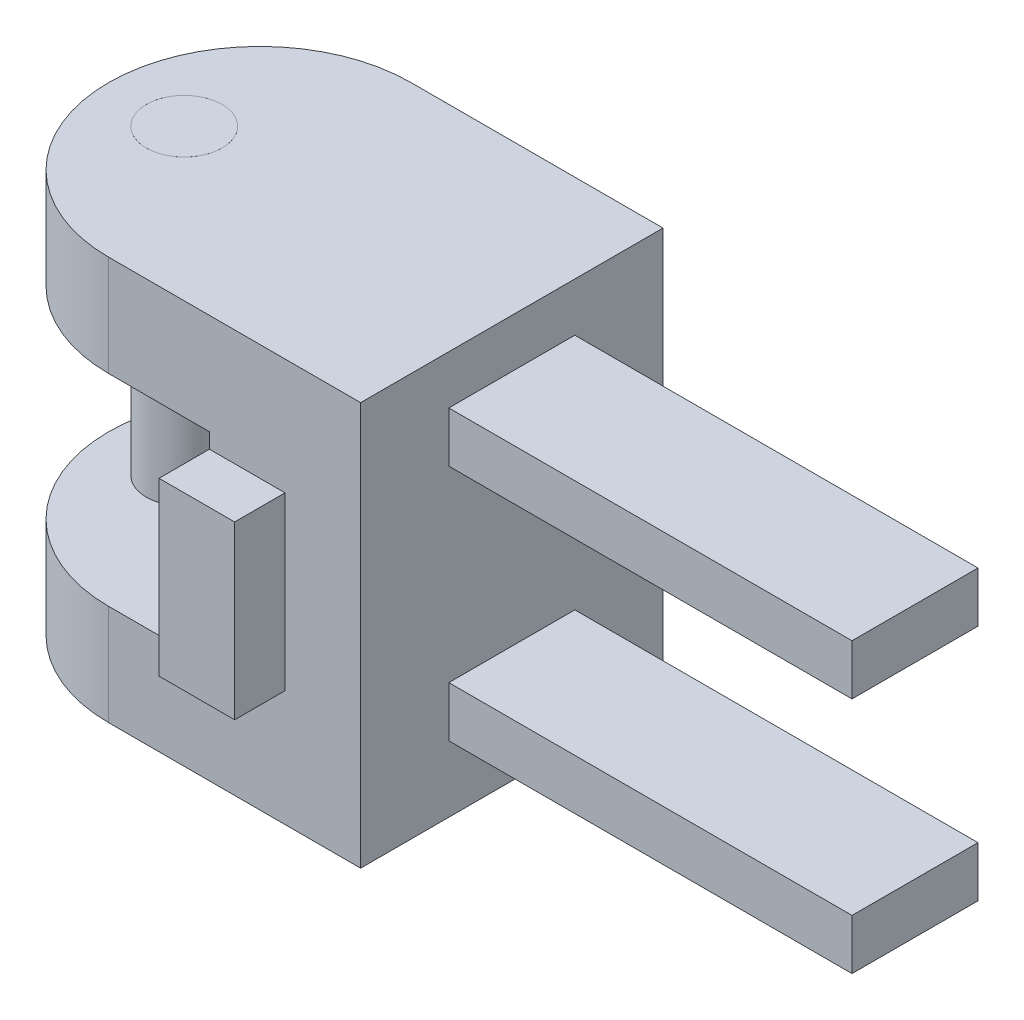
ISO-10303-21;
HEADER;
FILE_DESCRIPTION(('STEP AP214'),'2;1');
FILE_NAME('part.step','',(''),(''),'','','');
FILE_SCHEMA(('AUTOMOTIVE_DESIGN { 1 0 10303 214 1 1 1 1 }'));
ENDSEC;
DATA;
#1=APPLICATION_CONTEXT('core data for automotive mechanical design processes');
#2=APPLICATION_PROTOCOL_DEFINITION('international standard','automotive_design',2000,#1);
#3=PRODUCT_CONTEXT('',#1,'mechanical');
#4=PRODUCT('Part','Part','',(#3));
#5=PRODUCT_RELATED_PRODUCT_CATEGORY('part','',(#4));
#6=PRODUCT_DEFINITION_FORMATION('','',#4);
#7=PRODUCT_DEFINITION_CONTEXT('part definition',#1,'design');
#8=PRODUCT_DEFINITION('design','',#6,#7);
#9=PRODUCT_DEFINITION_SHAPE('','',#8);
#10=(LENGTH_UNIT() NAMED_UNIT(*) SI_UNIT(.MILLI.,.METRE.));
#11=(NAMED_UNIT(*) PLANE_ANGLE_UNIT() SI_UNIT($,.RADIAN.));
#12=(NAMED_UNIT(*) SI_UNIT($,.STERADIAN.) SOLID_ANGLE_UNIT());
#13=UNCERTAINTY_MEASURE_WITH_UNIT(LENGTH_MEASURE(1.E-05),#10,'distance_accuracy_value','');
#14=(GEOMETRIC_REPRESENTATION_CONTEXT(3) GLOBAL_UNCERTAINTY_ASSIGNED_CONTEXT((#13)) GLOBAL_UNIT_ASSIGNED_CONTEXT((#10,
#11,#12)) REPRESENTATION_CONTEXT('',''));
#15=CARTESIAN_POINT('',(0.,0.,0.));
#16=DIRECTION('',(0.,0.,1.));
#17=DIRECTION('',(1.,0.,0.));
#18=AXIS2_PLACEMENT_3D('',#15,#16,#17);
#19=CARTESIAN_POINT('',(-65.,0.,0.));
#20=DIRECTION('',(0.,1.,0.));
#21=DIRECTION('',(0.,0.,1.));
#22=AXIS2_PLACEMENT_3D('',#19,#20,#21);
#23=CYLINDRICAL_SURFACE('',#22,7.50000000000001);
#24=CARTESIAN_POINT('',(-65.,0.,0.));
#25=DIRECTION('',(0.,1.,0.));
#26=DIRECTION('',(0.,0.,1.));
#27=AXIS2_PLACEMENT_3D('',#24,#25,#26);
#28=CIRCLE('',#27,7.50000000000001);
#29=CARTESIAN_POINT('',(-65.,0.,7.50000000000001));
#30=VERTEX_POINT('',#29);
#31=EDGE_CURVE('E11',#30,#30,#28,.T.);
#32=ORIENTED_EDGE('',*,*,#31,.T.);
#33=EDGE_LOOP('',(#32));
#34=FACE_BOUND('',#33,.T.);
#35=CARTESIAN_POINT('',(-65.,80.,0.));
#36=DIRECTION('',(0.,1.,0.));
#37=DIRECTION('',(0.,0.,1.));
#38=AXIS2_PLACEMENT_3D('',#35,#36,#37);
#39=CIRCLE('',#38,7.50000000000001);
#40=CARTESIAN_POINT('',(-65.,80.,7.50000000000001));
#41=VERTEX_POINT('',#40);
#42=EDGE_CURVE('E55',#41,#41,#39,.T.);
#43=ORIENTED_EDGE('',*,*,#42,.F.);
#44=EDGE_LOOP('',(#43));
#45=FACE_BOUND('',#44,.T.);
#46=ADVANCED_FACE('F49',(#34,#45),#23,.T.);
#47=CARTESIAN_POINT('',(-65.,0.,0.));
#48=DIRECTION('',(0.,1.,0.));
#49=DIRECTION('',(0.,0.,1.));
#50=AXIS2_PLACEMENT_3D('',#47,#48,#49);
#51=PLANE('',#50);
#52=ORIENTED_EDGE('',*,*,#31,.F.);
#53=EDGE_LOOP('',(#52));
#54=FACE_BOUND('',#53,.T.);
#55=ADVANCED_FACE('F64',(#54),#51,.F.);
#56=CARTESIAN_POINT('',(-65.,80.,0.));
#57=DIRECTION('',(0.,1.,0.));
#58=DIRECTION('',(0.,0.,1.));
#59=AXIS2_PLACEMENT_3D('',#56,#57,#58);
#60=PLANE('',#59);
#61=ORIENTED_EDGE('',*,*,#42,.T.);
#62=EDGE_LOOP('',(#61));
#63=FACE_BOUND('',#62,.T.);
#64=ADVANCED_FACE('F61',(#63),#60,.T.);
#65=CLOSED_SHELL('',(#46,#55,#64));
#66=MANIFOLD_SOLID_BREP('B2',#65);
#67=CARTESIAN_POINT('',(0.,0.,-30.));
#68=DIRECTION('',(0.,0.,-1.));
#69=DIRECTION('',(-1.,0.,0.));
#70=AXIS2_PLACEMENT_3D('',#67,#68,#69);
#71=PLANE('',#70);
#72=DIRECTION('',(0.,-1.,0.));
#73=VECTOR('',#72,1.);
#74=CARTESIAN_POINT('',(-15.,57.,-30.));
#75=LINE('',#74,#73);
#76=CARTESIAN_POINT('',(-15.,57.,-30.));
#77=VERTEX_POINT('',#76);
#78=CARTESIAN_POINT('',(-15.,23.,-30.));
#79=VERTEX_POINT('',#78);
#80=EDGE_CURVE('E944',#77,#79,#75,.T.);
#81=ORIENTED_EDGE('',*,*,#80,.F.);
#82=DIRECTION('',(1.,0.,0.));
#83=VECTOR('',#82,1.);
#84=CARTESIAN_POINT('',(-30.,57.,-30.));
#85=LINE('',#84,#83);
#86=CARTESIAN_POINT('',(-30.,57.,-30.));
#87=VERTEX_POINT('',#86);
#88=EDGE_CURVE('E958',#87,#77,#85,.T.);
#89=ORIENTED_EDGE('',*,*,#88,.F.);
#90=DIRECTION('',(0.,1.,0.));
#91=VECTOR('',#90,1.);
#92=CARTESIAN_POINT('',(-30.,20.,-30.));
#93=LINE('',#92,#91);
#94=CARTESIAN_POINT('',(-30.,60.,-30.));
#95=VERTEX_POINT('',#94);
#96=EDGE_CURVE('E289',#87,#95,#93,.T.);
#97=ORIENTED_EDGE('',*,*,#96,.T.);
#98=DIRECTION('',(1.,0.,0.));
#99=VECTOR('',#98,1.);
#100=CARTESIAN_POINT('',(-80.,60.,-30.));
#101=LINE('',#100,#99);
#102=CARTESIAN_POINT('',(-50.,60.,-30.));
#103=VERTEX_POINT('',#102);
#104=EDGE_CURVE('E437',#103,#95,#101,.T.);
#105=ORIENTED_EDGE('',*,*,#104,.F.);
#106=DIRECTION('',(0.,-1.,0.));
#107=VECTOR('',#106,1.);
#108=CARTESIAN_POINT('',(-50.,0.,-30.));
#109=LINE('',#108,#107);
#110=CARTESIAN_POINT('',(-50.,80.,-30.));
#111=VERTEX_POINT('',#110);
#112=EDGE_CURVE('E98',#103,#111,#109,.F.);
#113=ORIENTED_EDGE('',*,*,#112,.T.);
#114=DIRECTION('',(-1.,0.,0.));
#115=VECTOR('',#114,1.);
#116=CARTESIAN_POINT('',(0.,80.,-30.));
#117=LINE('',#116,#115);
#118=CARTESIAN_POINT('',(0.,80.,-30.));
#119=VERTEX_POINT('',#118);
#120=EDGE_CURVE('E441',#119,#111,#117,.T.);
#121=ORIENTED_EDGE('',*,*,#120,.F.);
#122=DIRECTION('',(0.,-1.,0.));
#123=VECTOR('',#122,1.);
#124=CARTESIAN_POINT('',(0.,40.,-30.));
#125=LINE('',#124,#123);
#126=CARTESIAN_POINT('',(0.,0.,-30.));
#127=VERTEX_POINT('',#126);
#128=EDGE_CURVE('E477',#119,#127,#125,.T.);
#129=ORIENTED_EDGE('',*,*,#128,.T.);
#130=DIRECTION('',(-1.,0.,0.));
#131=VECTOR('',#130,1.);
#132=CARTESIAN_POINT('',(0.,0.,-30.));
#133=LINE('',#132,#131);
#134=CARTESIAN_POINT('',(-50.,0.,-30.));
#135=VERTEX_POINT('',#134);
#136=EDGE_CURVE('E481',#127,#135,#133,.T.);
#137=ORIENTED_EDGE('',*,*,#136,.T.);
#138=DIRECTION('',(0.,1.,0.));
#139=VECTOR('',#138,1.);
#140=CARTESIAN_POINT('',(-50.,20.,-30.));
#141=LINE('',#140,#139);
#142=CARTESIAN_POINT('',(-50.,20.,-30.));
#143=VERTEX_POINT('',#142);
#144=EDGE_CURVE('E511',#135,#143,#141,.T.);
#145=ORIENTED_EDGE('',*,*,#144,.T.);
#146=DIRECTION('',(1.,0.,0.));
#147=VECTOR('',#146,1.);
#148=CARTESIAN_POINT('',(-80.,20.,-30.));
#149=LINE('',#148,#147);
#150=CARTESIAN_POINT('',(-30.,20.,-30.));
#151=VERTEX_POINT('',#150);
#152=EDGE_CURVE('E485',#143,#151,#149,.T.);
#153=ORIENTED_EDGE('',*,*,#152,.T.);
#154=CARTESIAN_POINT('',(-30.,23.,-30.));
#155=VERTEX_POINT('',#154);
#156=EDGE_CURVE('E488',#151,#155,#93,.T.);
#157=ORIENTED_EDGE('',*,*,#156,.T.);
#158=DIRECTION('',(-1.,0.,0.));
#159=VECTOR('',#158,1.);
#160=CARTESIAN_POINT('',(-30.,23.,-30.));
#161=LINE('',#160,#159);
#162=EDGE_CURVE('E283',#79,#155,#161,.T.);
#163=ORIENTED_EDGE('',*,*,#162,.F.);
#164=EDGE_LOOP('',(#81,#89,#97,#105,#113,#121,#129,#137,#145,#153,#157,#163));
#165=FACE_BOUND('',#164,.T.);
#166=ADVANCED_FACE('F89',(#165),#71,.T.);
#167=CARTESIAN_POINT('',(0.,40.,-30.));
#168=DIRECTION('',(-1.,0.,0.));
#169=DIRECTION('',(0.,-1.,0.));
#170=AXIS2_PLACEMENT_3D('',#167,#168,#169);
#171=PLANE('',#170);
#172=DIRECTION('',(0.,1.,0.));
#173=VECTOR('',#172,1.);
#174=CARTESIAN_POINT('',(0.,60.3368659406556,-12.5));
#175=LINE('',#174,#173);
#176=CARTESIAN_POINT('',(0.,60.3368659406556,-12.5));
#177=VERTEX_POINT('',#176);
#178=CARTESIAN_POINT('',(0.,70.3368659406556,-12.5));
#179=VERTEX_POINT('',#178);
#180=EDGE_CURVE('E379',#177,#179,#175,.T.);
#181=ORIENTED_EDGE('',*,*,#180,.F.);
#182=DIRECTION('',(0.,0.,-1.));
#183=VECTOR('',#182,1.);
#184=CARTESIAN_POINT('',(0.,60.3368659406556,-12.5));
#185=LINE('',#184,#183);
#186=CARTESIAN_POINT('',(0.,60.3368659406556,12.5));
#187=VERTEX_POINT('',#186);
#188=EDGE_CURVE('E385',#187,#177,#185,.T.);
#189=ORIENTED_EDGE('',*,*,#188,.F.);
#190=DIRECTION('',(0.,-1.,0.));
#191=VECTOR('',#190,1.);
#192=CARTESIAN_POINT('',(0.,60.3368659406556,12.5));
#193=LINE('',#192,#191);
#194=CARTESIAN_POINT('',(0.,70.3368659406556,12.5));
#195=VERTEX_POINT('',#194);
#196=EDGE_CURVE('E402',#195,#187,#193,.T.);
#197=ORIENTED_EDGE('',*,*,#196,.F.);
#198=DIRECTION('',(0.,0.,1.));
#199=VECTOR('',#198,1.);
#200=CARTESIAN_POINT('',(0.,70.3368659406556,-12.5));
#201=LINE('',#200,#199);
#202=EDGE_CURVE('E398',#179,#195,#201,.T.);
#203=ORIENTED_EDGE('',*,*,#202,.F.);
#204=EDGE_LOOP('',(#181,#189,#197,#203));
#205=FACE_BOUND('',#204,.T.);
#206=ORIENTED_EDGE('',*,*,#128,.F.);
#207=DIRECTION('',(0.,0.,1.));
#208=VECTOR('',#207,1.);
#209=CARTESIAN_POINT('',(0.,80.,-30.));
#210=LINE('',#209,#208);
#211=CARTESIAN_POINT('',(0.,80.,30.));
#212=VERTEX_POINT('',#211);
#213=EDGE_CURVE('E445',#119,#212,#210,.T.);
#214=ORIENTED_EDGE('',*,*,#213,.T.);
#215=DIRECTION('',(0.,-1.,0.));
#216=VECTOR('',#215,1.);
#217=CARTESIAN_POINT('',(0.,40.,30.));
#218=LINE('',#217,#216);
#219=CARTESIAN_POINT('',(0.,0.,30.));
#220=VERTEX_POINT('',#219);
#221=EDGE_CURVE('E461',#212,#220,#218,.T.);
#222=ORIENTED_EDGE('',*,*,#221,.T.);
#223=DIRECTION('',(0.,0.,1.));
#224=VECTOR('',#223,1.);
#225=CARTESIAN_POINT('',(0.,0.,-30.));
#226=LINE('',#225,#224);
#227=EDGE_CURVE('E495',#127,#220,#226,.T.);
#228=ORIENTED_EDGE('',*,*,#227,.F.);
#229=EDGE_LOOP('',(#206,#214,#222,#228));
#230=FACE_BOUND('',#229,.T.);
#231=DIRECTION('',(0.,1.,0.));
#232=VECTOR('',#231,1.);
#233=CARTESIAN_POINT('',(0.,13.1389492179323,-12.5));
#234=LINE('',#233,#232);
#235=CARTESIAN_POINT('',(0.,13.1389492179323,-12.5));
#236=VERTEX_POINT('',#235);
#237=CARTESIAN_POINT('',(0.,23.1389492179323,-12.5));
#238=VERTEX_POINT('',#237);
#239=EDGE_CURVE('E323',#236,#238,#234,.T.);
#240=ORIENTED_EDGE('',*,*,#239,.F.);
#241=DIRECTION('',(0.,0.,-1.));
#242=VECTOR('',#241,1.);
#243=CARTESIAN_POINT('',(0.,13.1389492179323,-12.5));
#244=LINE('',#243,#242);
#245=CARTESIAN_POINT('',(0.,13.1389492179323,12.5));
#246=VERTEX_POINT('',#245);
#247=EDGE_CURVE('E340',#246,#236,#244,.T.);
#248=ORIENTED_EDGE('',*,*,#247,.F.);
#249=DIRECTION('',(0.,-1.,0.));
#250=VECTOR('',#249,1.);
#251=CARTESIAN_POINT('',(0.,13.1389492179323,12.5));
#252=LINE('',#251,#250);
#253=CARTESIAN_POINT('',(0.,23.1389492179324,12.5));
#254=VERTEX_POINT('',#253);
#255=EDGE_CURVE('E357',#254,#246,#252,.T.);
#256=ORIENTED_EDGE('',*,*,#255,.F.);
#257=DIRECTION('',(0.,0.,1.));
#258=VECTOR('',#257,1.);
#259=CARTESIAN_POINT('',(0.,23.1389492179323,-12.5));
#260=LINE('',#259,#258);
#261=EDGE_CURVE('E353',#238,#254,#260,.T.);
#262=ORIENTED_EDGE('',*,*,#261,.F.);
#263=EDGE_LOOP('',(#240,#248,#256,#262));
#264=FACE_BOUND('',#263,.T.);
#265=ADVANCED_FACE('F563',(#205,#230,#264),#171,.F.);
#266=CARTESIAN_POINT('',(0.,0.,-30.));
#267=DIRECTION('',(0.,1.,0.));
#268=DIRECTION('',(-1.,0.,0.));
#269=AXIS2_PLACEMENT_3D('',#266,#267,#268);
#270=PLANE('',#269);
#271=CARTESIAN_POINT('',(-65.,0.,0.));
#272=DIRECTION('',(0.,1.,0.));
#273=DIRECTION('',(-1.,0.,0.));
#274=AXIS2_PLACEMENT_3D('',#271,#272,#273);
#275=CIRCLE('',#274,7.50000000000001);
#276=CARTESIAN_POINT('',(-72.5,0.,0.));
#277=VERTEX_POINT('',#276);
#278=EDGE_CURVE('E457',#277,#277,#275,.T.);
#279=ORIENTED_EDGE('',*,*,#278,.T.);
#280=EDGE_LOOP('',(#279));
#281=FACE_BOUND('',#280,.T.);
#282=CARTESIAN_POINT('',(-50.,0.,0.));
#283=DIRECTION('',(0.,1.,0.));
#284=DIRECTION('',(-1.,0.,0.));
#285=AXIS2_PLACEMENT_3D('',#282,#283,#284);
#286=CIRCLE('',#285,30.);
#287=CARTESIAN_POINT('',(-50.,0.,30.));
#288=VERTEX_POINT('',#287);
#289=CARTESIAN_POINT('',(-80.,0.,0.));
#290=VERTEX_POINT('',#289);
#291=EDGE_CURVE('E508',#288,#290,#286,.F.);
#292=ORIENTED_EDGE('',*,*,#291,.T.);
#293=CARTESIAN_POINT('',(-50.,0.,0.));
#294=DIRECTION('',(0.,1.,0.));
#295=DIRECTION('',(-1.,0.,0.));
#296=AXIS2_PLACEMENT_3D('',#293,#294,#295);
#297=CIRCLE('',#296,30.);
#298=EDGE_CURVE('E518',#290,#135,#297,.F.);
#299=ORIENTED_EDGE('',*,*,#298,.T.);
#300=ORIENTED_EDGE('',*,*,#136,.F.);
#301=ORIENTED_EDGE('',*,*,#227,.T.);
#302=DIRECTION('',(-1.,0.,0.));
#303=VECTOR('',#302,1.);
#304=CARTESIAN_POINT('',(0.,0.,30.));
#305=LINE('',#304,#303);
#306=EDGE_CURVE('E465',#220,#288,#305,.T.);
#307=ORIENTED_EDGE('',*,*,#306,.T.);
#308=EDGE_LOOP('',(#292,#299,#300,#301,#307));
#309=FACE_BOUND('',#308,.T.);
#310=ADVANCED_FACE('F582',(#281,#309),#270,.F.);
#311=CARTESIAN_POINT('',(-80.,20.,-30.));
#312=DIRECTION('',(0.,-1.,0.));
#313=DIRECTION('',(0.,0.,-1.));
#314=AXIS2_PLACEMENT_3D('',#311,#312,#313);
#315=PLANE('',#314);
#316=CARTESIAN_POINT('',(-65.,20.,0.));
#317=DIRECTION('',(0.,1.,0.));
#318=DIRECTION('',(0.,0.,1.));
#319=AXIS2_PLACEMENT_3D('',#316,#317,#318);
#320=CIRCLE('',#319,7.50000000000001);
#321=CARTESIAN_POINT('',(-65.,20.,7.50000000000001));
#322=VERTEX_POINT('',#321);
#323=EDGE_CURVE('E453',#322,#322,#320,.T.);
#324=ORIENTED_EDGE('',*,*,#323,.F.);
#325=EDGE_LOOP('',(#324));
#326=FACE_BOUND('',#325,.T.);
#327=ORIENTED_EDGE('',*,*,#152,.F.);
#328=CARTESIAN_POINT('',(-50.,20.,0.));
#329=DIRECTION('',(0.,-1.,0.));
#330=DIRECTION('',(0.,0.,-1.));
#331=AXIS2_PLACEMENT_3D('',#328,#329,#330);
#332=CIRCLE('',#331,30.);
#333=CARTESIAN_POINT('',(-80.,20.,0.));
#334=VERTEX_POINT('',#333);
#335=EDGE_CURVE('E515',#143,#334,#332,.F.);
#336=ORIENTED_EDGE('',*,*,#335,.T.);
#337=CARTESIAN_POINT('',(-50.,20.,0.));
#338=DIRECTION('',(0.,-1.,0.));
#339=DIRECTION('',(0.,0.,-1.));
#340=AXIS2_PLACEMENT_3D('',#337,#338,#339);
#341=CIRCLE('',#340,30.);
#342=CARTESIAN_POINT('',(-50.,20.,30.));
#343=VERTEX_POINT('',#342);
#344=EDGE_CURVE('E502',#334,#343,#341,.F.);
#345=ORIENTED_EDGE('',*,*,#344,.T.);
#346=DIRECTION('',(1.,0.,0.));
#347=VECTOR('',#346,1.);
#348=CARTESIAN_POINT('',(-80.,20.,30.));
#349=LINE('',#348,#347);
#350=CARTESIAN_POINT('',(-30.,20.,30.));
#351=VERTEX_POINT('',#350);
#352=EDGE_CURVE('E469',#343,#351,#349,.T.);
#353=ORIENTED_EDGE('',*,*,#352,.T.);
#354=DIRECTION('',(0.,0.,1.));
#355=VECTOR('',#354,1.);
#356=CARTESIAN_POINT('',(-30.,20.,-30.));
#357=LINE('',#356,#355);
#358=EDGE_CURVE('E492',#151,#351,#357,.T.);
#359=ORIENTED_EDGE('',*,*,#358,.F.);
#360=EDGE_LOOP('',(#327,#336,#345,#353,#359));
#361=FACE_BOUND('',#360,.T.);
#362=ADVANCED_FACE('F574',(#326,#361),#315,.F.);
#363=CARTESIAN_POINT('',(-30.,20.,-30.));
#364=DIRECTION('',(1.,0.,0.));
#365=DIRECTION('',(0.,0.,-1.));
#366=AXIS2_PLACEMENT_3D('',#363,#364,#365);
#367=PLANE('',#366);
#368=ORIENTED_EDGE('',*,*,#358,.T.);
#369=DIRECTION('',(0.,1.,0.));
#370=VECTOR('',#369,1.);
#371=CARTESIAN_POINT('',(-30.,20.,30.));
#372=LINE('',#371,#370);
#373=CARTESIAN_POINT('',(-30.,23.,30.));
#374=VERTEX_POINT('',#373);
#375=EDGE_CURVE('E473',#351,#374,#372,.T.);
#376=ORIENTED_EDGE('',*,*,#375,.T.);
#377=DIRECTION('',(0.,0.,-1.));
#378=VECTOR('',#377,1.);
#379=CARTESIAN_POINT('',(-30.,23.,40.));
#380=LINE('',#379,#378);
#381=CARTESIAN_POINT('',(-30.,23.,40.));
#382=VERTEX_POINT('',#381);
#383=EDGE_CURVE('E324',#382,#374,#380,.T.);
#384=ORIENTED_EDGE('',*,*,#383,.F.);
#385=DIRECTION('',(0.,1.,0.));
#386=VECTOR('',#385,1.);
#387=CARTESIAN_POINT('',(-30.,23.,40.));
#388=LINE('',#387,#386);
#389=CARTESIAN_POINT('',(-30.,57.,40.));
#390=VERTEX_POINT('',#389);
#391=EDGE_CURVE('E310',#382,#390,#388,.T.);
#392=ORIENTED_EDGE('',*,*,#391,.T.);
#393=DIRECTION('',(0.,0.,-1.));
#394=VECTOR('',#393,1.);
#395=CARTESIAN_POINT('',(-30.,57.,40.));
#396=LINE('',#395,#394);
#397=CARTESIAN_POINT('',(-30.,57.,30.));
#398=VERTEX_POINT('',#397);
#399=EDGE_CURVE('E319',#390,#398,#396,.T.);
#400=ORIENTED_EDGE('',*,*,#399,.T.);
#401=CARTESIAN_POINT('',(-30.,60.,30.));
#402=VERTEX_POINT('',#401);
#403=EDGE_CURVE('E472',#398,#402,#372,.T.);
#404=ORIENTED_EDGE('',*,*,#403,.T.);
#405=DIRECTION('',(0.,0.,1.));
#406=VECTOR('',#405,1.);
#407=CARTESIAN_POINT('',(-30.,60.,-30.));
#408=LINE('',#407,#406);
#409=EDGE_CURVE('E449',#95,#402,#408,.T.);
#410=ORIENTED_EDGE('',*,*,#409,.F.);
#411=ORIENTED_EDGE('',*,*,#96,.F.);
#412=DIRECTION('',(0.,0.,1.));
#413=VECTOR('',#412,1.);
#414=CARTESIAN_POINT('',(-30.,57.,-40.));
#415=LINE('',#414,#413);
#416=CARTESIAN_POINT('',(-30.,57.,-40.));
#417=VERTEX_POINT('',#416);
#418=EDGE_CURVE('E266',#417,#87,#415,.T.);
#419=ORIENTED_EDGE('',*,*,#418,.F.);
#420=DIRECTION('',(0.,1.,0.));
#421=VECTOR('',#420,1.);
#422=CARTESIAN_POINT('',(-30.,57.,-40.));
#423=LINE('',#422,#421);
#424=CARTESIAN_POINT('',(-30.,23.,-40.));
#425=VERTEX_POINT('',#424);
#426=EDGE_CURVE('E274',#425,#417,#423,.T.);
#427=ORIENTED_EDGE('',*,*,#426,.F.);
#428=DIRECTION('',(0.,0.,1.));
#429=VECTOR('',#428,1.);
#430=CARTESIAN_POINT('',(-30.,23.,-40.));
#431=LINE('',#430,#429);
#432=EDGE_CURVE('E942',#425,#155,#431,.T.);
#433=ORIENTED_EDGE('',*,*,#432,.T.);
#434=ORIENTED_EDGE('',*,*,#156,.F.);
#435=EDGE_LOOP('',(#368,#376,#384,#392,#400,#404,#410,#411,#419,#427,#433,#434));
#436=FACE_BOUND('',#435,.T.);
#437=ADVANCED_FACE('F287',(#436),#367,.F.);
#438=CARTESIAN_POINT('',(0.,0.,30.));
#439=DIRECTION('',(0.,0.,-1.));
#440=DIRECTION('',(-1.,0.,0.));
#441=AXIS2_PLACEMENT_3D('',#438,#439,#440);
#442=PLANE('',#441);
#443=ORIENTED_EDGE('',*,*,#403,.F.);
#444=DIRECTION('',(1.,0.,0.));
#445=VECTOR('',#444,1.);
#446=CARTESIAN_POINT('',(-30.,57.,30.));
#447=LINE('',#446,#445);
#448=CARTESIAN_POINT('',(-15.,57.,30.));
#449=VERTEX_POINT('',#448);
#450=EDGE_CURVE('E291',#398,#449,#447,.T.);
#451=ORIENTED_EDGE('',*,*,#450,.T.);
#452=DIRECTION('',(0.,1.,0.));
#453=VECTOR('',#452,1.);
#454=CARTESIAN_POINT('',(-15.,23.,30.));
#455=LINE('',#454,#453);
#456=CARTESIAN_POINT('',(-15.,23.,30.));
#457=VERTEX_POINT('',#456);
#458=EDGE_CURVE('E113',#457,#449,#455,.T.);
#459=ORIENTED_EDGE('',*,*,#458,.F.);
#460=DIRECTION('',(1.,0.,0.));
#461=VECTOR('',#460,1.);
#462=CARTESIAN_POINT('',(-30.,23.,30.));
#463=LINE('',#462,#461);
#464=EDGE_CURVE('E304',#374,#457,#463,.T.);
#465=ORIENTED_EDGE('',*,*,#464,.F.);
#466=ORIENTED_EDGE('',*,*,#375,.F.);
#467=ORIENTED_EDGE('',*,*,#352,.F.);
#468=DIRECTION('',(0.,1.,0.));
#469=VECTOR('',#468,1.);
#470=CARTESIAN_POINT('',(-50.,0.,30.));
#471=LINE('',#470,#469);
#472=EDGE_CURVE('E505',#343,#288,#471,.F.);
#473=ORIENTED_EDGE('',*,*,#472,.T.);
#474=ORIENTED_EDGE('',*,*,#306,.F.);
#475=ORIENTED_EDGE('',*,*,#221,.F.);
#476=DIRECTION('',(-1.,0.,0.));
#477=VECTOR('',#476,1.);
#478=CARTESIAN_POINT('',(0.,80.,30.));
#479=LINE('',#478,#477);
#480=CARTESIAN_POINT('',(-50.,80.,30.));
#481=VERTEX_POINT('',#480);
#482=EDGE_CURVE('E433',#212,#481,#479,.T.);
#483=ORIENTED_EDGE('',*,*,#482,.T.);
#484=DIRECTION('',(0.,-1.,0.));
#485=VECTOR('',#484,1.);
#486=CARTESIAN_POINT('',(-50.,60.,30.));
#487=LINE('',#486,#485);
#488=CARTESIAN_POINT('',(-50.,60.,30.));
#489=VERTEX_POINT('',#488);
#490=EDGE_CURVE('E521',#481,#489,#487,.T.);
#491=ORIENTED_EDGE('',*,*,#490,.T.);
#492=DIRECTION('',(1.,0.,0.));
#493=VECTOR('',#492,1.);
#494=CARTESIAN_POINT('',(-80.,60.,30.));
#495=LINE('',#494,#493);
#496=EDGE_CURVE('E429',#489,#402,#495,.T.);
#497=ORIENTED_EDGE('',*,*,#496,.T.);
#498=EDGE_LOOP('',(#443,#451,#459,#465,#466,#467,#473,#474,#475,#483,#491,#497));
#499=FACE_BOUND('',#498,.T.);
#500=ADVANCED_FACE('F558',(#499),#442,.F.);
#501=CARTESIAN_POINT('',(-65.,-10.,0.));
#502=DIRECTION('',(0.,1.,0.));
#503=DIRECTION('',(0.,0.,1.));
#504=AXIS2_PLACEMENT_3D('',#501,#502,#503);
#505=CYLINDRICAL_SURFACE('',#504,7.50000000000001);
#506=ORIENTED_EDGE('',*,*,#323,.T.);
#507=EDGE_LOOP('',(#506));
#508=FACE_BOUND('',#507,.T.);
#509=ORIENTED_EDGE('',*,*,#278,.F.);
#510=EDGE_LOOP('',(#509));
#511=FACE_BOUND('',#510,.T.);
#512=ADVANCED_FACE('F605',(#508,#511),#505,.F.);
#513=CARTESIAN_POINT('',(-50.,0.,0.));
#514=DIRECTION('',(0.,1.,0.));
#515=DIRECTION('',(0.,0.,1.));
#516=AXIS2_PLACEMENT_3D('',#513,#514,#515);
#517=CYLINDRICAL_SURFACE('',#516,30.);
#518=ORIENTED_EDGE('',*,*,#291,.F.);
#519=ORIENTED_EDGE('',*,*,#472,.F.);
#520=ORIENTED_EDGE('',*,*,#344,.F.);
#521=DIRECTION('',(0.,1.,0.));
#522=VECTOR('',#521,1.);
#523=CARTESIAN_POINT('',(-80.,0.,0.));
#524=LINE('',#523,#522);
#525=EDGE_CURVE('E498',#290,#334,#524,.T.);
#526=ORIENTED_EDGE('',*,*,#525,.F.);
#527=EDGE_LOOP('',(#518,#519,#520,#526));
#528=FACE_BOUND('',#527,.T.);
#529=ADVANCED_FACE('F580',(#528),#517,.T.);
#530=CARTESIAN_POINT('',(-50.,0.,0.));
#531=DIRECTION('',(0.,-1.,0.));
#532=DIRECTION('',(0.,0.,-1.));
#533=AXIS2_PLACEMENT_3D('',#530,#531,#532);
#534=CYLINDRICAL_SURFACE('',#533,30.);
#535=ORIENTED_EDGE('',*,*,#298,.F.);
#536=ORIENTED_EDGE('',*,*,#525,.T.);
#537=ORIENTED_EDGE('',*,*,#335,.F.);
#538=ORIENTED_EDGE('',*,*,#144,.F.);
#539=EDGE_LOOP('',(#535,#536,#537,#538));
#540=FACE_BOUND('',#539,.T.);
#541=ADVANCED_FACE('F570',(#540),#534,.T.);
#542=CARTESIAN_POINT('',(-80.,60.,-30.));
#543=DIRECTION('',(0.,-1.,0.));
#544=DIRECTION('',(0.,0.,-1.));
#545=AXIS2_PLACEMENT_3D('',#542,#543,#544);
#546=PLANE('',#545);
#547=CARTESIAN_POINT('',(-65.,60.,0.));
#548=DIRECTION('',(0.,1.,0.));
#549=DIRECTION('',(0.,0.,1.));
#550=AXIS2_PLACEMENT_3D('',#547,#548,#549);
#551=CIRCLE('',#550,7.50000000000001);
#552=CARTESIAN_POINT('',(-65.,60.,7.50000000000001));
#553=VERTEX_POINT('',#552);
#554=EDGE_CURVE('E424',#553,#553,#551,.T.);
#555=ORIENTED_EDGE('',*,*,#554,.T.);
#556=EDGE_LOOP('',(#555));
#557=FACE_BOUND('',#556,.T.);
#558=CARTESIAN_POINT('',(-50.,60.,0.));
#559=DIRECTION('',(0.,-1.,0.));
#560=DIRECTION('',(0.,0.,-1.));
#561=AXIS2_PLACEMENT_3D('',#558,#559,#560);
#562=CIRCLE('',#561,30.);
#563=CARTESIAN_POINT('',(-80.,60.,0.));
#564=VERTEX_POINT('',#563);
#565=EDGE_CURVE('E528',#489,#564,#562,.T.);
#566=ORIENTED_EDGE('',*,*,#565,.T.);
#567=CARTESIAN_POINT('',(-50.,60.,0.));
#568=DIRECTION('',(0.,-1.,0.));
#569=DIRECTION('',(0.,0.,-1.));
#570=AXIS2_PLACEMENT_3D('',#567,#568,#569);
#571=CIRCLE('',#570,30.);
#572=EDGE_CURVE('E539',#564,#103,#571,.T.);
#573=ORIENTED_EDGE('',*,*,#572,.T.);
#574=ORIENTED_EDGE('',*,*,#104,.T.);
#575=ORIENTED_EDGE('',*,*,#409,.T.);
#576=ORIENTED_EDGE('',*,*,#496,.F.);
#577=EDGE_LOOP('',(#566,#573,#574,#575,#576));
#578=FACE_BOUND('',#577,.T.);
#579=ADVANCED_FACE('F616',(#557,#578),#546,.T.);
#580=CARTESIAN_POINT('',(0.,80.,-30.));
#581=DIRECTION('',(0.,1.,0.));
#582=DIRECTION('',(-1.,0.,0.));
#583=AXIS2_PLACEMENT_3D('',#580,#581,#582);
#584=PLANE('',#583);
#585=CARTESIAN_POINT('',(-65.,80.,0.));
#586=DIRECTION('',(0.,1.,0.));
#587=DIRECTION('',(-1.,0.,0.));
#588=AXIS2_PLACEMENT_3D('',#585,#586,#587);
#589=CIRCLE('',#588,7.50000000000001);
#590=CARTESIAN_POINT('',(-72.5,80.,0.));
#591=VERTEX_POINT('',#590);
#592=EDGE_CURVE('E428',#591,#591,#589,.F.);
#593=ORIENTED_EDGE('',*,*,#592,.T.);
#594=EDGE_LOOP('',(#593));
#595=FACE_BOUND('',#594,.T.);
#596=ORIENTED_EDGE('',*,*,#120,.T.);
#597=CARTESIAN_POINT('',(-50.,80.,0.));
#598=DIRECTION('',(0.,1.,0.));
#599=DIRECTION('',(-1.,0.,0.));
#600=AXIS2_PLACEMENT_3D('',#597,#598,#599);
#601=CIRCLE('',#600,30.);
#602=CARTESIAN_POINT('',(-80.,80.,0.));
#603=VERTEX_POINT('',#602);
#604=EDGE_CURVE('E47',#111,#603,#601,.T.);
#605=ORIENTED_EDGE('',*,*,#604,.T.);
#606=CARTESIAN_POINT('',(-50.,80.,0.));
#607=DIRECTION('',(0.,1.,0.));
#608=DIRECTION('',(-1.,0.,0.));
#609=AXIS2_PLACEMENT_3D('',#606,#607,#608);
#610=CIRCLE('',#609,30.);
#611=EDGE_CURVE('E536',#603,#481,#610,.T.);
#612=ORIENTED_EDGE('',*,*,#611,.T.);
#613=ORIENTED_EDGE('',*,*,#482,.F.);
#614=ORIENTED_EDGE('',*,*,#213,.F.);
#615=EDGE_LOOP('',(#596,#605,#612,#613,#614));
#616=FACE_BOUND('',#615,.T.);
#617=ADVANCED_FACE('F551',(#595,#616),#584,.T.);
#618=CARTESIAN_POINT('',(-65.,90.,0.));
#619=DIRECTION('',(0.,-1.,0.));
#620=DIRECTION('',(0.,0.,-1.));
#621=AXIS2_PLACEMENT_3D('',#618,#619,#620);
#622=CYLINDRICAL_SURFACE('',#621,7.50000000000001);
#623=ORIENTED_EDGE('',*,*,#592,.F.);
#624=EDGE_LOOP('',(#623));
#625=FACE_BOUND('',#624,.T.);
#626=ORIENTED_EDGE('',*,*,#554,.F.);
#627=EDGE_LOOP('',(#626));
#628=FACE_BOUND('',#627,.T.);
#629=ADVANCED_FACE('F622',(#625,#628),#622,.F.);
#630=CARTESIAN_POINT('',(-50.,0.,0.));
#631=DIRECTION('',(0.,1.,0.));
#632=DIRECTION('',(0.,0.,1.));
#633=AXIS2_PLACEMENT_3D('',#630,#631,#632);
#634=CYLINDRICAL_SURFACE('',#633,30.);
#635=ORIENTED_EDGE('',*,*,#611,.F.);
#636=DIRECTION('',(0.,-1.,0.));
#637=VECTOR('',#636,1.);
#638=CARTESIAN_POINT('',(-80.,80.,0.));
#639=LINE('',#638,#637);
#640=EDGE_CURVE('E532',#564,#603,#639,.F.);
#641=ORIENTED_EDGE('',*,*,#640,.F.);
#642=ORIENTED_EDGE('',*,*,#565,.F.);
#643=ORIENTED_EDGE('',*,*,#490,.F.);
#644=EDGE_LOOP('',(#635,#641,#642,#643));
#645=FACE_BOUND('',#644,.T.);
#646=ADVANCED_FACE('F556',(#645),#634,.T.);
#647=CARTESIAN_POINT('',(-50.,80.,0.));
#648=DIRECTION('',(0.,-1.,0.));
#649=DIRECTION('',(0.,0.,-1.));
#650=AXIS2_PLACEMENT_3D('',#647,#648,#649);
#651=CYLINDRICAL_SURFACE('',#650,30.);
#652=ORIENTED_EDGE('',*,*,#604,.F.);
#653=ORIENTED_EDGE('',*,*,#112,.F.);
#654=ORIENTED_EDGE('',*,*,#572,.F.);
#655=ORIENTED_EDGE('',*,*,#640,.T.);
#656=EDGE_LOOP('',(#652,#653,#654,#655));
#657=FACE_BOUND('',#656,.T.);
#658=ADVANCED_FACE('F91',(#657),#651,.T.);
#659=CARTESIAN_POINT('',(80.,60.3368659406556,-12.5));
#660=DIRECTION('',(0.,0.,1.));
#661=DIRECTION('',(1.,0.,0.));
#662=AXIS2_PLACEMENT_3D('',#659,#660,#661);
#663=PLANE('',#662);
#664=ORIENTED_EDGE('',*,*,#180,.T.);
#665=DIRECTION('',(-1.,0.,0.));
#666=VECTOR('',#665,1.);
#667=CARTESIAN_POINT('',(80.,70.3368659406556,-12.5));
#668=LINE('',#667,#666);
#669=CARTESIAN_POINT('',(80.,70.3368659406556,-12.5));
#670=VERTEX_POINT('',#669);
#671=EDGE_CURVE('E420',#670,#179,#668,.T.);
#672=ORIENTED_EDGE('',*,*,#671,.F.);
#673=DIRECTION('',(0.,1.,0.));
#674=VECTOR('',#673,1.);
#675=CARTESIAN_POINT('',(80.,60.3368659406556,-12.5));
#676=LINE('',#675,#674);
#677=CARTESIAN_POINT('',(80.,60.3368659406556,-12.5));
#678=VERTEX_POINT('',#677);
#679=EDGE_CURVE('E380',#678,#670,#676,.T.);
#680=ORIENTED_EDGE('',*,*,#679,.F.);
#681=DIRECTION('',(-1.,0.,0.));
#682=VECTOR('',#681,1.);
#683=CARTESIAN_POINT('',(80.,60.3368659406556,-12.5));
#684=LINE('',#683,#682);
#685=EDGE_CURVE('E394',#678,#177,#684,.T.);
#686=ORIENTED_EDGE('',*,*,#685,.T.);
#687=EDGE_LOOP('',(#664,#672,#680,#686));
#688=FACE_BOUND('',#687,.T.);
#689=ADVANCED_FACE('F627',(#688),#663,.F.);
#690=CARTESIAN_POINT('',(80.,70.3368659406556,-12.5));
#691=DIRECTION('',(0.,-1.,0.));
#692=DIRECTION('',(1.,0.,0.));
#693=AXIS2_PLACEMENT_3D('',#690,#691,#692);
#694=PLANE('',#693);
#695=ORIENTED_EDGE('',*,*,#202,.T.);
#696=DIRECTION('',(-1.,0.,0.));
#697=VECTOR('',#696,1.);
#698=CARTESIAN_POINT('',(80.,70.3368659406556,12.5));
#699=LINE('',#698,#697);
#700=CARTESIAN_POINT('',(80.,70.3368659406556,12.5));
#701=VERTEX_POINT('',#700);
#702=EDGE_CURVE('E416',#701,#195,#699,.T.);
#703=ORIENTED_EDGE('',*,*,#702,.F.);
#704=DIRECTION('',(0.,0.,1.));
#705=VECTOR('',#704,1.);
#706=CARTESIAN_POINT('',(80.,70.3368659406556,-12.5));
#707=LINE('',#706,#705);
#708=EDGE_CURVE('E384',#670,#701,#707,.T.);
#709=ORIENTED_EDGE('',*,*,#708,.F.);
#710=ORIENTED_EDGE('',*,*,#671,.T.);
#711=EDGE_LOOP('',(#695,#703,#709,#710));
#712=FACE_BOUND('',#711,.T.);
#713=ADVANCED_FACE('F630',(#712),#694,.F.);
#714=CARTESIAN_POINT('',(80.,60.3368659406556,12.5));
#715=DIRECTION('',(0.,0.,-1.));
#716=DIRECTION('',(-1.,0.,0.));
#717=AXIS2_PLACEMENT_3D('',#714,#715,#716);
#718=PLANE('',#717);
#719=ORIENTED_EDGE('',*,*,#196,.T.);
#720=DIRECTION('',(-1.,0.,0.));
#721=VECTOR('',#720,1.);
#722=CARTESIAN_POINT('',(80.,60.3368659406556,12.5));
#723=LINE('',#722,#721);
#724=CARTESIAN_POINT('',(80.,60.3368659406556,12.5));
#725=VERTEX_POINT('',#724);
#726=EDGE_CURVE('E412',#725,#187,#723,.T.);
#727=ORIENTED_EDGE('',*,*,#726,.F.);
#728=DIRECTION('',(0.,-1.,0.));
#729=VECTOR('',#728,1.);
#730=CARTESIAN_POINT('',(80.,60.3368659406556,12.5));
#731=LINE('',#730,#729);
#732=EDGE_CURVE('E388',#701,#725,#731,.T.);
#733=ORIENTED_EDGE('',*,*,#732,.F.);
#734=ORIENTED_EDGE('',*,*,#702,.T.);
#735=EDGE_LOOP('',(#719,#727,#733,#734));
#736=FACE_BOUND('',#735,.T.);
#737=ADVANCED_FACE('F634',(#736),#718,.F.);
#738=CARTESIAN_POINT('',(80.,60.3368659406556,-12.5));
#739=DIRECTION('',(0.,1.,0.));
#740=DIRECTION('',(-1.,0.,0.));
#741=AXIS2_PLACEMENT_3D('',#738,#739,#740);
#742=PLANE('',#741);
#743=ORIENTED_EDGE('',*,*,#188,.T.);
#744=ORIENTED_EDGE('',*,*,#685,.F.);
#745=DIRECTION('',(0.,0.,-1.));
#746=VECTOR('',#745,1.);
#747=CARTESIAN_POINT('',(80.,60.3368659406556,-12.5));
#748=LINE('',#747,#746);
#749=EDGE_CURVE('E391',#725,#678,#748,.T.);
#750=ORIENTED_EDGE('',*,*,#749,.F.);
#751=ORIENTED_EDGE('',*,*,#726,.T.);
#752=EDGE_LOOP('',(#743,#744,#750,#751));
#753=FACE_BOUND('',#752,.T.);
#754=ADVANCED_FACE('F638',(#753),#742,.F.);
#755=CARTESIAN_POINT('',(80.,0.,0.));
#756=DIRECTION('',(1.,0.,0.));
#757=DIRECTION('',(0.,1.,0.));
#758=AXIS2_PLACEMENT_3D('',#755,#756,#757);
#759=PLANE('',#758);
#760=ORIENTED_EDGE('',*,*,#679,.T.);
#761=ORIENTED_EDGE('',*,*,#708,.T.);
#762=ORIENTED_EDGE('',*,*,#732,.T.);
#763=ORIENTED_EDGE('',*,*,#749,.T.);
#764=EDGE_LOOP('',(#760,#761,#762,#763));
#765=FACE_BOUND('',#764,.T.);
#766=ADVANCED_FACE('F642',(#765),#759,.T.);
#767=CARTESIAN_POINT('',(80.,13.1389492179324,-12.5));
#768=DIRECTION('',(0.,0.,1.));
#769=DIRECTION('',(1.,0.,0.));
#770=AXIS2_PLACEMENT_3D('',#767,#768,#769);
#771=PLANE('',#770);
#772=ORIENTED_EDGE('',*,*,#239,.T.);
#773=DIRECTION('',(-1.,0.,0.));
#774=VECTOR('',#773,1.);
#775=CARTESIAN_POINT('',(80.,23.1389492179324,-12.5));
#776=LINE('',#775,#774);
#777=CARTESIAN_POINT('',(80.,23.1389492179324,-12.5));
#778=VERTEX_POINT('',#777);
#779=EDGE_CURVE('E375',#778,#238,#776,.T.);
#780=ORIENTED_EDGE('',*,*,#779,.F.);
#781=DIRECTION('',(0.,1.,0.));
#782=VECTOR('',#781,1.);
#783=CARTESIAN_POINT('',(80.,13.1389492179324,-12.5));
#784=LINE('',#783,#782);
#785=CARTESIAN_POINT('',(80.,13.1389492179324,-12.5));
#786=VERTEX_POINT('',#785);
#787=EDGE_CURVE('E335',#786,#778,#784,.T.);
#788=ORIENTED_EDGE('',*,*,#787,.F.);
#789=DIRECTION('',(-1.,0.,0.));
#790=VECTOR('',#789,1.);
#791=CARTESIAN_POINT('',(80.,13.1389492179324,-12.5));
#792=LINE('',#791,#790);
#793=EDGE_CURVE('E349',#786,#236,#792,.T.);
#794=ORIENTED_EDGE('',*,*,#793,.T.);
#795=EDGE_LOOP('',(#772,#780,#788,#794));
#796=FACE_BOUND('',#795,.T.);
#797=ADVANCED_FACE('F646',(#796),#771,.F.);
#798=CARTESIAN_POINT('',(80.,23.1389492179324,-12.5));
#799=DIRECTION('',(0.,-1.,0.));
#800=DIRECTION('',(1.,0.,0.));
#801=AXIS2_PLACEMENT_3D('',#798,#799,#800);
#802=PLANE('',#801);
#803=ORIENTED_EDGE('',*,*,#261,.T.);
#804=DIRECTION('',(-1.,0.,0.));
#805=VECTOR('',#804,1.);
#806=CARTESIAN_POINT('',(80.,23.1389492179324,12.5));
#807=LINE('',#806,#805);
#808=CARTESIAN_POINT('',(80.,23.1389492179324,12.5));
#809=VERTEX_POINT('',#808);
#810=EDGE_CURVE('E371',#809,#254,#807,.T.);
#811=ORIENTED_EDGE('',*,*,#810,.F.);
#812=DIRECTION('',(0.,0.,1.));
#813=VECTOR('',#812,1.);
#814=CARTESIAN_POINT('',(80.,23.1389492179324,-12.5));
#815=LINE('',#814,#813);
#816=EDGE_CURVE('E339',#778,#809,#815,.T.);
#817=ORIENTED_EDGE('',*,*,#816,.F.);
#818=ORIENTED_EDGE('',*,*,#779,.T.);
#819=EDGE_LOOP('',(#803,#811,#817,#818));
#820=FACE_BOUND('',#819,.T.);
#821=ADVANCED_FACE('F650',(#820),#802,.F.);
#822=CARTESIAN_POINT('',(80.,13.1389492179324,12.5));
#823=DIRECTION('',(0.,0.,-1.));
#824=DIRECTION('',(-1.,0.,0.));
#825=AXIS2_PLACEMENT_3D('',#822,#823,#824);
#826=PLANE('',#825);
#827=ORIENTED_EDGE('',*,*,#255,.T.);
#828=DIRECTION('',(-1.,0.,0.));
#829=VECTOR('',#828,1.);
#830=CARTESIAN_POINT('',(80.,13.1389492179324,12.5));
#831=LINE('',#830,#829);
#832=CARTESIAN_POINT('',(80.,13.1389492179324,12.5));
#833=VERTEX_POINT('',#832);
#834=EDGE_CURVE('E367',#833,#246,#831,.T.);
#835=ORIENTED_EDGE('',*,*,#834,.F.);
#836=DIRECTION('',(0.,-1.,0.));
#837=VECTOR('',#836,1.);
#838=CARTESIAN_POINT('',(80.,13.1389492179324,12.5));
#839=LINE('',#838,#837);
#840=EDGE_CURVE('E343',#809,#833,#839,.T.);
#841=ORIENTED_EDGE('',*,*,#840,.F.);
#842=ORIENTED_EDGE('',*,*,#810,.T.);
#843=EDGE_LOOP('',(#827,#835,#841,#842));
#844=FACE_BOUND('',#843,.T.);
#845=ADVANCED_FACE('F654',(#844),#826,.F.);
#846=CARTESIAN_POINT('',(80.,13.1389492179324,-12.5));
#847=DIRECTION('',(0.,1.,0.));
#848=DIRECTION('',(-1.,0.,0.));
#849=AXIS2_PLACEMENT_3D('',#846,#847,#848);
#850=PLANE('',#849);
#851=ORIENTED_EDGE('',*,*,#247,.T.);
#852=ORIENTED_EDGE('',*,*,#793,.F.);
#853=DIRECTION('',(0.,0.,-1.));
#854=VECTOR('',#853,1.);
#855=CARTESIAN_POINT('',(80.,13.1389492179324,-12.5));
#856=LINE('',#855,#854);
#857=EDGE_CURVE('E346',#833,#786,#856,.T.);
#858=ORIENTED_EDGE('',*,*,#857,.F.);
#859=ORIENTED_EDGE('',*,*,#834,.T.);
#860=EDGE_LOOP('',(#851,#852,#858,#859));
#861=FACE_BOUND('',#860,.T.);
#862=ADVANCED_FACE('F658',(#861),#850,.F.);
#863=CARTESIAN_POINT('',(80.,0.,0.));
#864=DIRECTION('',(1.,0.,0.));
#865=DIRECTION('',(0.,1.,0.));
#866=AXIS2_PLACEMENT_3D('',#863,#864,#865);
#867=PLANE('',#866);
#868=ORIENTED_EDGE('',*,*,#787,.T.);
#869=ORIENTED_EDGE('',*,*,#816,.T.);
#870=ORIENTED_EDGE('',*,*,#840,.T.);
#871=ORIENTED_EDGE('',*,*,#857,.T.);
#872=EDGE_LOOP('',(#868,#869,#870,#871));
#873=FACE_BOUND('',#872,.T.);
#874=ADVANCED_FACE('F662',(#873),#867,.T.);
#875=CARTESIAN_POINT('',(-30.,57.,40.));
#876=DIRECTION('',(0.,1.,0.));
#877=DIRECTION('',(0.,0.,1.));
#878=AXIS2_PLACEMENT_3D('',#875,#876,#877);
#879=PLANE('',#878);
#880=ORIENTED_EDGE('',*,*,#450,.F.);
#881=ORIENTED_EDGE('',*,*,#399,.F.);
#882=DIRECTION('',(1.,0.,0.));
#883=VECTOR('',#882,1.);
#884=CARTESIAN_POINT('',(-30.,57.,40.));
#885=LINE('',#884,#883);
#886=CARTESIAN_POINT('',(-15.,57.,40.));
#887=VERTEX_POINT('',#886);
#888=EDGE_CURVE('E299',#390,#887,#885,.T.);
#889=ORIENTED_EDGE('',*,*,#888,.T.);
#890=DIRECTION('',(0.,0.,-1.));
#891=VECTOR('',#890,1.);
#892=CARTESIAN_POINT('',(-15.,57.,40.));
#893=LINE('',#892,#891);
#894=EDGE_CURVE('E313',#887,#449,#893,.T.);
#895=ORIENTED_EDGE('',*,*,#894,.T.);
#896=EDGE_LOOP('',(#880,#881,#889,#895));
#897=FACE_BOUND('',#896,.T.);
#898=ADVANCED_FACE('F666',(#897),#879,.T.);
#899=CARTESIAN_POINT('',(-30.,23.,40.));
#900=DIRECTION('',(0.,1.,0.));
#901=DIRECTION('',(0.,0.,1.));
#902=AXIS2_PLACEMENT_3D('',#899,#900,#901);
#903=PLANE('',#902);
#904=ORIENTED_EDGE('',*,*,#464,.T.);
#905=DIRECTION('',(0.,0.,-1.));
#906=VECTOR('',#905,1.);
#907=CARTESIAN_POINT('',(-15.,23.,40.));
#908=LINE('',#907,#906);
#909=CARTESIAN_POINT('',(-15.,23.,40.));
#910=VERTEX_POINT('',#909);
#911=EDGE_CURVE('E328',#910,#457,#908,.T.);
#912=ORIENTED_EDGE('',*,*,#911,.F.);
#913=DIRECTION('',(1.,0.,0.));
#914=VECTOR('',#913,1.);
#915=CARTESIAN_POINT('',(-30.,23.,40.));
#916=LINE('',#915,#914);
#917=EDGE_CURVE('E307',#382,#910,#916,.T.);
#918=ORIENTED_EDGE('',*,*,#917,.F.);
#919=ORIENTED_EDGE('',*,*,#383,.T.);
#920=EDGE_LOOP('',(#904,#912,#918,#919));
#921=FACE_BOUND('',#920,.T.);
#922=ADVANCED_FACE('F670',(#921),#903,.F.);
#923=CARTESIAN_POINT('',(-15.,23.,40.));
#924=DIRECTION('',(-1.,0.,0.));
#925=DIRECTION('',(0.,0.,1.));
#926=AXIS2_PLACEMENT_3D('',#923,#924,#925);
#927=PLANE('',#926);
#928=ORIENTED_EDGE('',*,*,#458,.T.);
#929=ORIENTED_EDGE('',*,*,#894,.F.);
#930=DIRECTION('',(0.,1.,0.));
#931=VECTOR('',#930,1.);
#932=CARTESIAN_POINT('',(-15.,23.,40.));
#933=LINE('',#932,#931);
#934=EDGE_CURVE('E303',#910,#887,#933,.T.);
#935=ORIENTED_EDGE('',*,*,#934,.F.);
#936=ORIENTED_EDGE('',*,*,#911,.T.);
#937=EDGE_LOOP('',(#928,#929,#935,#936));
#938=FACE_BOUND('',#937,.T.);
#939=ADVANCED_FACE('F672',(#938),#927,.F.);
#940=CARTESIAN_POINT('',(0.,0.,40.));
#941=DIRECTION('',(0.,0.,1.));
#942=DIRECTION('',(1.,0.,0.));
#943=AXIS2_PLACEMENT_3D('',#940,#941,#942);
#944=PLANE('',#943);
#945=ORIENTED_EDGE('',*,*,#888,.F.);
#946=ORIENTED_EDGE('',*,*,#391,.F.);
#947=ORIENTED_EDGE('',*,*,#917,.T.);
#948=ORIENTED_EDGE('',*,*,#934,.T.);
#949=EDGE_LOOP('',(#945,#946,#947,#948));
#950=FACE_BOUND('',#949,.T.);
#951=ADVANCED_FACE('F675',(#950),#944,.T.);
#952=CARTESIAN_POINT('',(-30.,57.,-40.));
#953=DIRECTION('',(0.,-1.,0.));
#954=DIRECTION('',(0.,0.,-1.));
#955=AXIS2_PLACEMENT_3D('',#952,#953,#954);
#956=PLANE('',#955);
#957=ORIENTED_EDGE('',*,*,#88,.T.);
#958=DIRECTION('',(0.,0.,1.));
#959=VECTOR('',#958,1.);
#960=CARTESIAN_POINT('',(-15.,57.,-40.));
#961=LINE('',#960,#959);
#962=CARTESIAN_POINT('',(-15.,57.,-40.));
#963=VERTEX_POINT('',#962);
#964=EDGE_CURVE('E269',#963,#77,#961,.T.);
#965=ORIENTED_EDGE('',*,*,#964,.F.);
#966=DIRECTION('',(1.,0.,0.));
#967=VECTOR('',#966,1.);
#968=CARTESIAN_POINT('',(-30.,57.,-40.));
#969=LINE('',#968,#967);
#970=EDGE_CURVE('E262',#417,#963,#969,.T.);
#971=ORIENTED_EDGE('',*,*,#970,.F.);
#972=ORIENTED_EDGE('',*,*,#418,.T.);
#973=EDGE_LOOP('',(#957,#965,#971,#972));
#974=FACE_BOUND('',#973,.T.);
#975=ADVANCED_FACE('F264',(#974),#956,.F.);
#976=CARTESIAN_POINT('',(-15.,57.,-40.));
#977=DIRECTION('',(-1.,0.,0.));
#978=DIRECTION('',(0.,-1.,0.));
#979=AXIS2_PLACEMENT_3D('',#976,#977,#978);
#980=PLANE('',#979);
#981=ORIENTED_EDGE('',*,*,#80,.T.);
#982=DIRECTION('',(0.,0.,1.));
#983=VECTOR('',#982,1.);
#984=CARTESIAN_POINT('',(-15.,23.,-40.));
#985=LINE('',#984,#983);
#986=CARTESIAN_POINT('',(-15.,23.,-40.));
#987=VERTEX_POINT('',#986);
#988=EDGE_CURVE('E105',#987,#79,#985,.T.);
#989=ORIENTED_EDGE('',*,*,#988,.F.);
#990=DIRECTION('',(0.,-1.,0.));
#991=VECTOR('',#990,1.);
#992=CARTESIAN_POINT('',(-15.,57.,-40.));
#993=LINE('',#992,#991);
#994=EDGE_CURVE('E273',#963,#987,#993,.T.);
#995=ORIENTED_EDGE('',*,*,#994,.F.);
#996=ORIENTED_EDGE('',*,*,#964,.T.);
#997=EDGE_LOOP('',(#981,#989,#995,#996));
#998=FACE_BOUND('',#997,.T.);
#999=ADVANCED_FACE('F685',(#998),#980,.F.);
#1000=CARTESIAN_POINT('',(-30.,23.,-40.));
#1001=DIRECTION('',(0.,1.,0.));
#1002=DIRECTION('',(0.,0.,1.));
#1003=AXIS2_PLACEMENT_3D('',#1000,#1001,#1002);
#1004=PLANE('',#1003);
#1005=ORIENTED_EDGE('',*,*,#162,.T.);
#1006=ORIENTED_EDGE('',*,*,#432,.F.);
#1007=DIRECTION('',(-1.,0.,0.));
#1008=VECTOR('',#1007,1.);
#1009=CARTESIAN_POINT('',(-30.,23.,-40.));
#1010=LINE('',#1009,#1008);
#1011=EDGE_CURVE('E278',#987,#425,#1010,.T.);
#1012=ORIENTED_EDGE('',*,*,#1011,.F.);
#1013=ORIENTED_EDGE('',*,*,#988,.T.);
#1014=EDGE_LOOP('',(#1005,#1006,#1012,#1013));
#1015=FACE_BOUND('',#1014,.T.);
#1016=ADVANCED_FACE('F688',(#1015),#1004,.F.);
#1017=CARTESIAN_POINT('',(0.,0.,-40.));
#1018=DIRECTION('',(0.,0.,1.));
#1019=DIRECTION('',(1.,0.,0.));
#1020=AXIS2_PLACEMENT_3D('',#1017,#1018,#1019);
#1021=PLANE('',#1020);
#1022=ORIENTED_EDGE('',*,*,#426,.T.);
#1023=ORIENTED_EDGE('',*,*,#970,.T.);
#1024=ORIENTED_EDGE('',*,*,#994,.T.);
#1025=ORIENTED_EDGE('',*,*,#1011,.T.);
#1026=EDGE_LOOP('',(#1022,#1023,#1024,#1025));
#1027=FACE_BOUND('',#1026,.T.);
#1028=ADVANCED_FACE('F277',(#1027),#1021,.F.);
#1029=CLOSED_SHELL('',(#166,#265,#310,#362,#437,#500,#512,#529,#541,#579,#617,#629,#646,#658,
#689,#713,#737,#754,#766,#797,#821,#845,#862,#874,#898,#922,#939,#951,#975,#999,#1016,#1028));
#1030=MANIFOLD_SOLID_BREP('B6',#1029);
#1031=ADVANCED_BREP_SHAPE_REPRESENTATION('',(#18,#66,#1030),#14);
#1032=SHAPE_DEFINITION_REPRESENTATION(#9,#1031);
ENDSEC;
END-ISO-10303-21;
